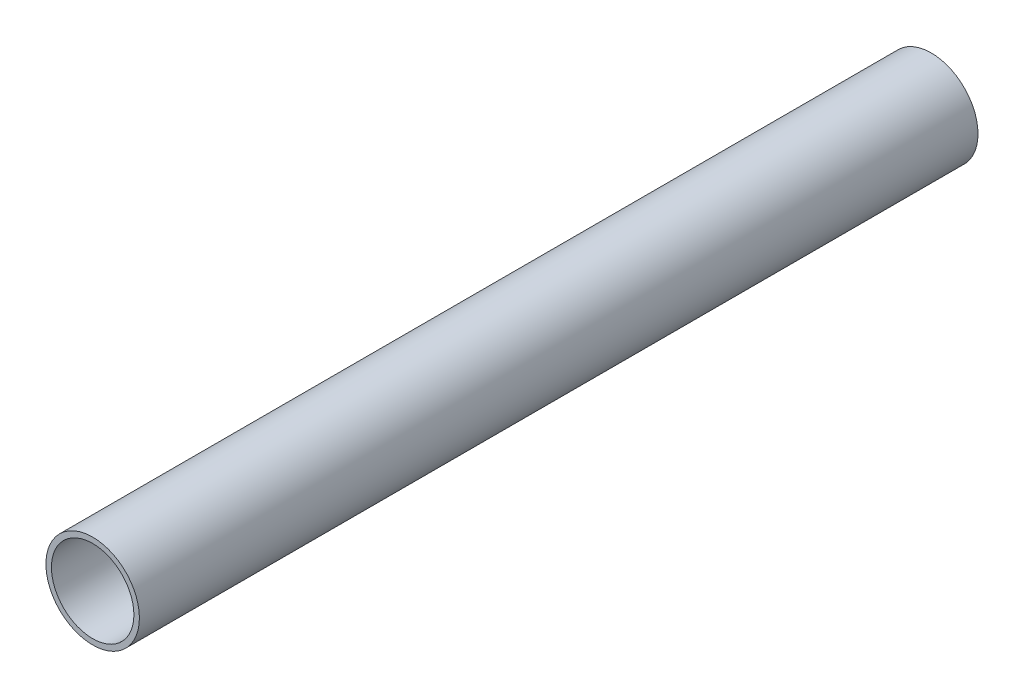
ISO-10303-21;
HEADER;
FILE_DESCRIPTION(('STEP AP214'),'2;1');
FILE_NAME('part.step','',(''),(''),'','','');
FILE_SCHEMA(('AUTOMOTIVE_DESIGN { 1 0 10303 214 1 1 1 1 }'));
ENDSEC;
DATA;
#1=APPLICATION_CONTEXT('core data for automotive mechanical design processes');
#2=APPLICATION_PROTOCOL_DEFINITION('international standard','automotive_design',2000,#1);
#3=PRODUCT_CONTEXT('',#1,'mechanical');
#4=PRODUCT('Part','Part','',(#3));
#5=PRODUCT_RELATED_PRODUCT_CATEGORY('part','',(#4));
#6=PRODUCT_DEFINITION_FORMATION('','',#4);
#7=PRODUCT_DEFINITION_CONTEXT('part definition',#1,'design');
#8=PRODUCT_DEFINITION('design','',#6,#7);
#9=PRODUCT_DEFINITION_SHAPE('','',#8);
#10=(LENGTH_UNIT() NAMED_UNIT(*) SI_UNIT(.MILLI.,.METRE.));
#11=(NAMED_UNIT(*) PLANE_ANGLE_UNIT() SI_UNIT($,.RADIAN.));
#12=(NAMED_UNIT(*) SI_UNIT($,.STERADIAN.) SOLID_ANGLE_UNIT());
#13=UNCERTAINTY_MEASURE_WITH_UNIT(LENGTH_MEASURE(1.E-05),#10,'distance_accuracy_value','');
#14=(GEOMETRIC_REPRESENTATION_CONTEXT(3) GLOBAL_UNCERTAINTY_ASSIGNED_CONTEXT((#13)) GLOBAL_UNIT_ASSIGNED_CONTEXT((#10,
#11,#12)) REPRESENTATION_CONTEXT('',''));
#15=CARTESIAN_POINT('',(0.,0.,0.));
#16=DIRECTION('',(0.,0.,1.));
#17=DIRECTION('',(1.,0.,0.));
#18=AXIS2_PLACEMENT_3D('',#15,#16,#17);
#19=CARTESIAN_POINT('',(0.,0.,305.));
#20=DIRECTION('',(0.,0.,1.));
#21=DIRECTION('',(1.,0.,0.));
#22=AXIS2_PLACEMENT_3D('',#19,#20,#21);
#23=PLANE('',#22);
#24=CARTESIAN_POINT('',(0.,0.,305.));
#25=DIRECTION('',(0.,0.,1.));
#26=DIRECTION('',(1.,0.,0.));
#27=AXIS2_PLACEMENT_3D('',#24,#25,#26);
#28=CIRCLE('',#27,17.);
#29=CARTESIAN_POINT('',(17.,0.,305.));
#30=VERTEX_POINT('',#29);
#31=EDGE_CURVE('E10',#30,#30,#28,.T.);
#32=ORIENTED_EDGE('',*,*,#31,.T.);
#33=EDGE_LOOP('',(#32));
#34=FACE_BOUND('',#33,.T.);
#35=CARTESIAN_POINT('',(0.,0.,305.));
#36=DIRECTION('',(0.,0.,1.));
#37=DIRECTION('',(1.,0.,0.));
#38=AXIS2_PLACEMENT_3D('',#35,#36,#37);
#39=CIRCLE('',#38,15.);
#40=CARTESIAN_POINT('',(15.,0.,305.));
#41=VERTEX_POINT('',#40);
#42=EDGE_CURVE('E44',#41,#41,#39,.T.);
#43=ORIENTED_EDGE('',*,*,#42,.F.);
#44=EDGE_LOOP('',(#43));
#45=FACE_BOUND('',#44,.T.);
#46=ADVANCED_FACE('F33',(#34,#45),#23,.T.);
#47=CARTESIAN_POINT('',(0.,0.,0.));
#48=DIRECTION('',(0.,0.,1.));
#49=DIRECTION('',(1.,0.,0.));
#50=AXIS2_PLACEMENT_3D('',#47,#48,#49);
#51=PLANE('',#50);
#52=CARTESIAN_POINT('',(0.,0.,0.));
#53=DIRECTION('',(0.,0.,1.));
#54=DIRECTION('',(1.,0.,0.));
#55=AXIS2_PLACEMENT_3D('',#52,#53,#54);
#56=CIRCLE('',#55,17.);
#57=CARTESIAN_POINT('',(17.,0.,0.));
#58=VERTEX_POINT('',#57);
#59=EDGE_CURVE('E37',#58,#58,#56,.T.);
#60=ORIENTED_EDGE('',*,*,#59,.F.);
#61=EDGE_LOOP('',(#60));
#62=FACE_BOUND('',#61,.T.);
#63=CARTESIAN_POINT('',(0.,0.,0.));
#64=DIRECTION('',(0.,0.,1.));
#65=DIRECTION('',(1.,0.,0.));
#66=AXIS2_PLACEMENT_3D('',#63,#64,#65);
#67=CIRCLE('',#66,15.);
#68=CARTESIAN_POINT('',(15.,0.,0.));
#69=VERTEX_POINT('',#68);
#70=EDGE_CURVE('E46',#69,#69,#67,.T.);
#71=ORIENTED_EDGE('',*,*,#70,.T.);
#72=EDGE_LOOP('',(#71));
#73=FACE_BOUND('',#72,.T.);
#74=ADVANCED_FACE('F56',(#62,#73),#51,.F.);
#75=CARTESIAN_POINT('',(0.,0.,305.));
#76=DIRECTION('',(0.,0.,-1.));
#77=DIRECTION('',(-1.,0.,0.));
#78=AXIS2_PLACEMENT_3D('',#75,#76,#77);
#79=CYLINDRICAL_SURFACE('',#78,17.);
#80=ORIENTED_EDGE('',*,*,#31,.F.);
#81=EDGE_LOOP('',(#80));
#82=FACE_BOUND('',#81,.T.);
#83=ORIENTED_EDGE('',*,*,#59,.T.);
#84=EDGE_LOOP('',(#83));
#85=FACE_BOUND('',#84,.T.);
#86=ADVANCED_FACE('F35',(#82,#85),#79,.T.);
#87=CARTESIAN_POINT('',(0.,0.,305.));
#88=DIRECTION('',(0.,0.,-1.));
#89=DIRECTION('',(-1.,0.,0.));
#90=AXIS2_PLACEMENT_3D('',#87,#88,#89);
#91=CYLINDRICAL_SURFACE('',#90,15.);
#92=ORIENTED_EDGE('',*,*,#42,.T.);
#93=EDGE_LOOP('',(#92));
#94=FACE_BOUND('',#93,.T.);
#95=ORIENTED_EDGE('',*,*,#70,.F.);
#96=EDGE_LOOP('',(#95));
#97=FACE_BOUND('',#96,.T.);
#98=ADVANCED_FACE('F52',(#94,#97),#91,.F.);
#99=CLOSED_SHELL('',(#46,#74,#86,#98));
#100=MANIFOLD_SOLID_BREP('B2',#99);
#101=ADVANCED_BREP_SHAPE_REPRESENTATION('',(#18,#100),#14);
#102=SHAPE_DEFINITION_REPRESENTATION(#9,#101);
ENDSEC;
END-ISO-10303-21;
